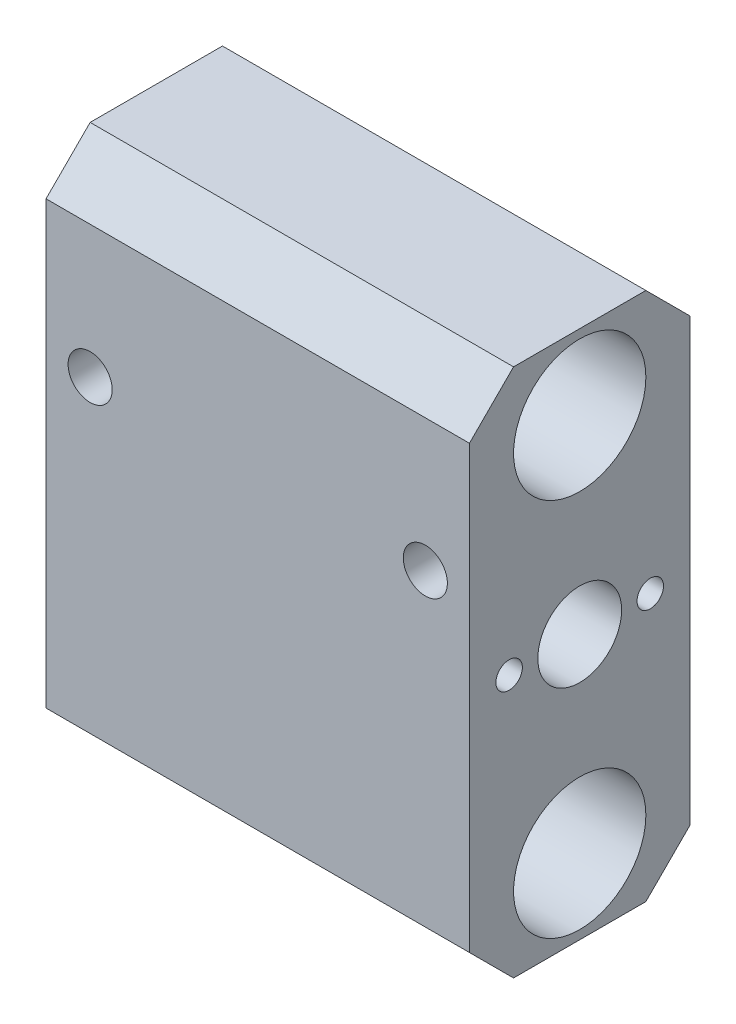
ISO-10303-21;
HEADER;
FILE_DESCRIPTION(('STEP AP214'),'2;1');
FILE_NAME('part.step','',(''),(''),'','','');
FILE_SCHEMA(('AUTOMOTIVE_DESIGN { 1 0 10303 214 1 1 1 1 }'));
ENDSEC;
DATA;
#1=APPLICATION_CONTEXT('core data for automotive mechanical design processes');
#2=APPLICATION_PROTOCOL_DEFINITION('international standard','automotive_design',2000,#1);
#3=PRODUCT_CONTEXT('',#1,'mechanical');
#4=PRODUCT('Part','Part','',(#3));
#5=PRODUCT_RELATED_PRODUCT_CATEGORY('part','',(#4));
#6=PRODUCT_DEFINITION_FORMATION('','',#4);
#7=PRODUCT_DEFINITION_CONTEXT('part definition',#1,'design');
#8=PRODUCT_DEFINITION('design','',#6,#7);
#9=PRODUCT_DEFINITION_SHAPE('','',#8);
#10=(LENGTH_UNIT() NAMED_UNIT(*) SI_UNIT(.MILLI.,.METRE.));
#11=(NAMED_UNIT(*) PLANE_ANGLE_UNIT() SI_UNIT($,.RADIAN.));
#12=(NAMED_UNIT(*) SI_UNIT($,.STERADIAN.) SOLID_ANGLE_UNIT());
#13=UNCERTAINTY_MEASURE_WITH_UNIT(LENGTH_MEASURE(1.E-05),#10,'distance_accuracy_value','');
#14=(GEOMETRIC_REPRESENTATION_CONTEXT(3) GLOBAL_UNCERTAINTY_ASSIGNED_CONTEXT((#13)) GLOBAL_UNIT_ASSIGNED_CONTEXT((#10,
#11,#12)) REPRESENTATION_CONTEXT('',''));
#15=CARTESIAN_POINT('',(0.,0.,0.));
#16=DIRECTION('',(0.,0.,1.));
#17=DIRECTION('',(1.,0.,0.));
#18=AXIS2_PLACEMENT_3D('',#15,#16,#17);
#19=CARTESIAN_POINT('',(48.,0.,0.));
#20=DIRECTION('',(-1.,0.,0.));
#21=DIRECTION('',(0.,0.,1.));
#22=AXIS2_PLACEMENT_3D('',#19,#20,#21);
#23=PLANE('',#22);
#24=CARTESIAN_POINT('',(48.,0.,-8.));
#25=DIRECTION('',(1.,0.,0.));
#26=DIRECTION('',(0.,0.,-1.));
#27=AXIS2_PLACEMENT_3D('',#24,#25,#26);
#28=CIRCLE('',#27,1.5);
#29=CARTESIAN_POINT('',(48.,0.,-9.5));
#30=VERTEX_POINT('',#29);
#31=EDGE_CURVE('E220',#30,#30,#28,.T.);
#32=ORIENTED_EDGE('',*,*,#31,.F.);
#33=EDGE_LOOP('',(#32));
#34=FACE_BOUND('',#33,.T.);
#35=CARTESIAN_POINT('',(48.,0.,8.));
#36=DIRECTION('',(1.,0.,0.));
#37=DIRECTION('',(0.,0.,-1.));
#38=AXIS2_PLACEMENT_3D('',#35,#36,#37);
#39=CIRCLE('',#38,1.5);
#40=CARTESIAN_POINT('',(48.,0.,6.5));
#41=VERTEX_POINT('',#40);
#42=EDGE_CURVE('E213',#41,#41,#39,.T.);
#43=ORIENTED_EDGE('',*,*,#42,.F.);
#44=EDGE_LOOP('',(#43));
#45=FACE_BOUND('',#44,.T.);
#46=DIRECTION('',(0.,0.,-1.));
#47=VECTOR('',#46,1.);
#48=CARTESIAN_POINT('',(48.,-30.,-12.5));
#49=LINE('',#48,#47);
#50=CARTESIAN_POINT('',(48.,-30.,7.50000000000001));
#51=VERTEX_POINT('',#50);
#52=CARTESIAN_POINT('',(48.,-30.,-7.50000000000001));
#53=VERTEX_POINT('',#52);
#54=EDGE_CURVE('E173',#51,#53,#49,.T.);
#55=ORIENTED_EDGE('',*,*,#54,.T.);
#56=DIRECTION('',(0.,-0.707106781186546,0.707106781186549));
#57=VECTOR('',#56,1.);
#58=CARTESIAN_POINT('',(48.,-25.,-12.5));
#59=LINE('',#58,#57);
#60=CARTESIAN_POINT('',(48.,-25.,-12.5));
#61=VERTEX_POINT('',#60);
#62=EDGE_CURVE('E151',#53,#61,#59,.F.);
#63=ORIENTED_EDGE('',*,*,#62,.T.);
#64=DIRECTION('',(0.,1.,0.));
#65=VECTOR('',#64,1.);
#66=CARTESIAN_POINT('',(48.,30.,-12.5));
#67=LINE('',#66,#65);
#68=CARTESIAN_POINT('',(48.,25.,-12.5));
#69=VERTEX_POINT('',#68);
#70=EDGE_CURVE('E121',#61,#69,#67,.T.);
#71=ORIENTED_EDGE('',*,*,#70,.T.);
#72=DIRECTION('',(0.,-0.707106781186549,-0.707106781186547));
#73=VECTOR('',#72,1.);
#74=CARTESIAN_POINT('',(48.,30.,-7.50000000000001));
#75=LINE('',#74,#73);
#76=CARTESIAN_POINT('',(48.,30.,-7.50000000000001));
#77=VERTEX_POINT('',#76);
#78=EDGE_CURVE('E57',#69,#77,#75,.F.);
#79=ORIENTED_EDGE('',*,*,#78,.T.);
#80=DIRECTION('',(0.,0.,1.));
#81=VECTOR('',#80,1.);
#82=CARTESIAN_POINT('',(48.,30.,-12.5));
#83=LINE('',#82,#81);
#84=CARTESIAN_POINT('',(48.,30.,7.49999999999999));
#85=VERTEX_POINT('',#84);
#86=EDGE_CURVE('E137',#77,#85,#83,.T.);
#87=ORIENTED_EDGE('',*,*,#86,.T.);
#88=DIRECTION('',(0.,0.707106781186546,-0.707106781186549));
#89=VECTOR('',#88,1.);
#90=CARTESIAN_POINT('',(48.,25.,12.5));
#91=LINE('',#90,#89);
#92=CARTESIAN_POINT('',(48.,25.,12.5));
#93=VERTEX_POINT('',#92);
#94=EDGE_CURVE('E147',#85,#93,#91,.F.);
#95=ORIENTED_EDGE('',*,*,#94,.T.);
#96=DIRECTION('',(0.,-1.,0.));
#97=VECTOR('',#96,1.);
#98=CARTESIAN_POINT('',(48.,30.,12.5));
#99=LINE('',#98,#97);
#100=CARTESIAN_POINT('',(48.,-25.,12.5));
#101=VERTEX_POINT('',#100);
#102=EDGE_CURVE('E131',#93,#101,#99,.T.);
#103=ORIENTED_EDGE('',*,*,#102,.T.);
#104=DIRECTION('',(0.,0.707106781186548,0.707106781186547));
#105=VECTOR('',#104,1.);
#106=CARTESIAN_POINT('',(48.,-30.,7.50000000000001));
#107=LINE('',#106,#105);
#108=EDGE_CURVE('E149',#101,#51,#107,.F.);
#109=ORIENTED_EDGE('',*,*,#108,.T.);
#110=EDGE_LOOP('',(#55,#63,#71,#79,#87,#95,#103,#109));
#111=FACE_BOUND('',#110,.T.);
#112=CARTESIAN_POINT('',(48.,0.,0.));
#113=DIRECTION('',(1.,0.,0.));
#114=DIRECTION('',(0.,0.,-1.));
#115=AXIS2_PLACEMENT_3D('',#112,#113,#114);
#116=CIRCLE('',#115,4.75);
#117=CARTESIAN_POINT('',(48.,0.,-4.75));
#118=VERTEX_POINT('',#117);
#119=EDGE_CURVE('E182',#118,#118,#116,.T.);
#120=ORIENTED_EDGE('',*,*,#119,.F.);
#121=EDGE_LOOP('',(#120));
#122=FACE_BOUND('',#121,.T.);
#123=CARTESIAN_POINT('',(48.,21.5,0.));
#124=DIRECTION('',(1.,0.,0.));
#125=DIRECTION('',(0.,0.,-1.));
#126=AXIS2_PLACEMENT_3D('',#123,#124,#125);
#127=CIRCLE('',#126,7.5);
#128=CARTESIAN_POINT('',(48.,21.5,-7.5));
#129=VERTEX_POINT('',#128);
#130=EDGE_CURVE('E187',#129,#129,#127,.T.);
#131=ORIENTED_EDGE('',*,*,#130,.F.);
#132=EDGE_LOOP('',(#131));
#133=FACE_BOUND('',#132,.T.);
#134=CARTESIAN_POINT('',(48.,-21.5,0.));
#135=DIRECTION('',(1.,0.,0.));
#136=DIRECTION('',(0.,0.,-1.));
#137=AXIS2_PLACEMENT_3D('',#134,#135,#136);
#138=CIRCLE('',#137,7.5);
#139=CARTESIAN_POINT('',(48.,-21.5,-7.5));
#140=VERTEX_POINT('',#139);
#141=EDGE_CURVE('E192',#140,#140,#138,.T.);
#142=ORIENTED_EDGE('',*,*,#141,.F.);
#143=EDGE_LOOP('',(#142));
#144=FACE_BOUND('',#143,.T.);
#145=ADVANCED_FACE('F37',(#34,#45,#111,#122,#133,#144),#23,.F.);
#146=CARTESIAN_POINT('',(0.,0.,0.));
#147=DIRECTION('',(-1.,0.,0.));
#148=DIRECTION('',(0.,0.,1.));
#149=AXIS2_PLACEMENT_3D('',#146,#147,#148);
#150=PLANE('',#149);
#151=CARTESIAN_POINT('',(0.,0.,8.));
#152=DIRECTION('',(-1.,0.,0.));
#153=DIRECTION('',(0.,0.,1.));
#154=AXIS2_PLACEMENT_3D('',#151,#152,#153);
#155=CIRCLE('',#154,1.5);
#156=CARTESIAN_POINT('',(0.,0.,9.5));
#157=VERTEX_POINT('',#156);
#158=EDGE_CURVE('E208',#157,#157,#155,.T.);
#159=ORIENTED_EDGE('',*,*,#158,.F.);
#160=EDGE_LOOP('',(#159));
#161=FACE_BOUND('',#160,.T.);
#162=CARTESIAN_POINT('',(0.,0.,-8.));
#163=DIRECTION('',(-1.,0.,0.));
#164=DIRECTION('',(0.,0.,1.));
#165=AXIS2_PLACEMENT_3D('',#162,#163,#164);
#166=CIRCLE('',#165,1.5);
#167=CARTESIAN_POINT('',(0.,0.,-6.5));
#168=VERTEX_POINT('',#167);
#169=EDGE_CURVE('E201',#168,#168,#166,.T.);
#170=ORIENTED_EDGE('',*,*,#169,.F.);
#171=EDGE_LOOP('',(#170));
#172=FACE_BOUND('',#171,.T.);
#173=CARTESIAN_POINT('',(0.,21.5,0.));
#174=DIRECTION('',(1.,0.,0.));
#175=DIRECTION('',(0.,0.,-1.));
#176=AXIS2_PLACEMENT_3D('',#173,#174,#175);
#177=CIRCLE('',#176,7.5);
#178=CARTESIAN_POINT('',(0.,21.5,-7.5));
#179=VERTEX_POINT('',#178);
#180=EDGE_CURVE('E189',#179,#179,#177,.T.);
#181=ORIENTED_EDGE('',*,*,#180,.T.);
#182=EDGE_LOOP('',(#181));
#183=FACE_BOUND('',#182,.T.);
#184=DIRECTION('',(0.,1.,0.));
#185=VECTOR('',#184,1.);
#186=CARTESIAN_POINT('',(0.,30.,-12.5));
#187=LINE('',#186,#185);
#188=CARTESIAN_POINT('',(0.,-25.,-12.5));
#189=VERTEX_POINT('',#188);
#190=CARTESIAN_POINT('',(0.,25.,-12.5));
#191=VERTEX_POINT('',#190);
#192=EDGE_CURVE('E119',#189,#191,#187,.T.);
#193=ORIENTED_EDGE('',*,*,#192,.F.);
#194=DIRECTION('',(0.,0.707106781186546,-0.707106781186549));
#195=VECTOR('',#194,1.);
#196=CARTESIAN_POINT('',(0.,-18.75,-18.75));
#197=LINE('',#196,#195);
#198=CARTESIAN_POINT('',(0.,-30.,-7.50000000000001));
#199=VERTEX_POINT('',#198);
#200=EDGE_CURVE('E102',#189,#199,#197,.F.);
#201=ORIENTED_EDGE('',*,*,#200,.T.);
#202=DIRECTION('',(0.,0.,-1.));
#203=VECTOR('',#202,1.);
#204=CARTESIAN_POINT('',(0.,-30.,-12.5));
#205=LINE('',#204,#203);
#206=CARTESIAN_POINT('',(0.,-30.,7.50000000000001));
#207=VERTEX_POINT('',#206);
#208=EDGE_CURVE('E129',#207,#199,#205,.T.);
#209=ORIENTED_EDGE('',*,*,#208,.F.);
#210=DIRECTION('',(0.,-0.707106781186548,-0.707106781186547));
#211=VECTOR('',#210,1.);
#212=CARTESIAN_POINT('',(0.,-18.75,18.75));
#213=LINE('',#212,#211);
#214=CARTESIAN_POINT('',(0.,-25.,12.5));
#215=VERTEX_POINT('',#214);
#216=EDGE_CURVE('E113',#207,#215,#213,.F.);
#217=ORIENTED_EDGE('',*,*,#216,.T.);
#218=DIRECTION('',(0.,-1.,0.));
#219=VECTOR('',#218,1.);
#220=CARTESIAN_POINT('',(0.,30.,12.5));
#221=LINE('',#220,#219);
#222=CARTESIAN_POINT('',(0.,25.,12.5));
#223=VERTEX_POINT('',#222);
#224=EDGE_CURVE('E133',#223,#215,#221,.T.);
#225=ORIENTED_EDGE('',*,*,#224,.F.);
#226=DIRECTION('',(0.,-0.707106781186546,0.707106781186549));
#227=VECTOR('',#226,1.);
#228=CARTESIAN_POINT('',(0.,18.7500000000001,18.75));
#229=LINE('',#228,#227);
#230=CARTESIAN_POINT('',(0.,30.,7.49999999999999));
#231=VERTEX_POINT('',#230);
#232=EDGE_CURVE('E140',#223,#231,#229,.F.);
#233=ORIENTED_EDGE('',*,*,#232,.T.);
#234=DIRECTION('',(0.,0.,1.));
#235=VECTOR('',#234,1.);
#236=CARTESIAN_POINT('',(0.,30.,-12.5));
#237=LINE('',#236,#235);
#238=CARTESIAN_POINT('',(0.,30.,-7.50000000000001));
#239=VERTEX_POINT('',#238);
#240=EDGE_CURVE('E128',#239,#231,#237,.T.);
#241=ORIENTED_EDGE('',*,*,#240,.F.);
#242=DIRECTION('',(0.,0.707106781186549,0.707106781186547));
#243=VECTOR('',#242,1.);
#244=CARTESIAN_POINT('',(0.,18.75,-18.75));
#245=LINE('',#244,#243);
#246=EDGE_CURVE('E122',#239,#191,#245,.F.);
#247=ORIENTED_EDGE('',*,*,#246,.T.);
#248=EDGE_LOOP('',(#193,#201,#209,#217,#225,#233,#241,#247));
#249=FACE_BOUND('',#248,.T.);
#250=CARTESIAN_POINT('',(0.,0.,0.));
#251=DIRECTION('',(1.,0.,0.));
#252=DIRECTION('',(0.,0.,-1.));
#253=AXIS2_PLACEMENT_3D('',#250,#251,#252);
#254=CIRCLE('',#253,4.75);
#255=CARTESIAN_POINT('',(0.,0.,-4.75));
#256=VERTEX_POINT('',#255);
#257=EDGE_CURVE('E178',#256,#256,#254,.T.);
#258=ORIENTED_EDGE('',*,*,#257,.T.);
#259=EDGE_LOOP('',(#258));
#260=FACE_BOUND('',#259,.T.);
#261=CARTESIAN_POINT('',(0.,-21.5,0.));
#262=DIRECTION('',(1.,0.,0.));
#263=DIRECTION('',(0.,0.,-1.));
#264=AXIS2_PLACEMENT_3D('',#261,#262,#263);
#265=CIRCLE('',#264,7.5);
#266=CARTESIAN_POINT('',(0.,-21.5,-7.5));
#267=VERTEX_POINT('',#266);
#268=EDGE_CURVE('E195',#267,#267,#265,.T.);
#269=ORIENTED_EDGE('',*,*,#268,.T.);
#270=EDGE_LOOP('',(#269));
#271=FACE_BOUND('',#270,.T.);
#272=ADVANCED_FACE('F125',(#161,#172,#183,#249,#260,#271),#150,.T.);
#273=CARTESIAN_POINT('',(48.,30.,12.5));
#274=DIRECTION('',(0.,0.,-1.));
#275=DIRECTION('',(0.,1.,0.));
#276=AXIS2_PLACEMENT_3D('',#273,#274,#275);
#277=PLANE('',#276);
#278=CARTESIAN_POINT('',(5.,9.99999999999999,12.5));
#279=DIRECTION('',(0.,0.,1.));
#280=DIRECTION('',(1.,0.,0.));
#281=AXIS2_PLACEMENT_3D('',#278,#279,#280);
#282=CIRCLE('',#281,2.5);
#283=CARTESIAN_POINT('',(7.5,9.99999999999999,12.5));
#284=VERTEX_POINT('',#283);
#285=EDGE_CURVE('E232',#284,#284,#282,.T.);
#286=ORIENTED_EDGE('',*,*,#285,.F.);
#287=EDGE_LOOP('',(#286));
#288=FACE_BOUND('',#287,.T.);
#289=CARTESIAN_POINT('',(43.,9.99999999999999,12.5));
#290=DIRECTION('',(0.,0.,1.));
#291=DIRECTION('',(-1.,0.,0.));
#292=AXIS2_PLACEMENT_3D('',#289,#290,#291);
#293=CIRCLE('',#292,2.49999999999999);
#294=CARTESIAN_POINT('',(40.5,9.99999999999999,12.5));
#295=VERTEX_POINT('',#294);
#296=EDGE_CURVE('E225',#295,#295,#293,.T.);
#297=ORIENTED_EDGE('',*,*,#296,.F.);
#298=EDGE_LOOP('',(#297));
#299=FACE_BOUND('',#298,.T.);
#300=ORIENTED_EDGE('',*,*,#224,.T.);
#301=DIRECTION('',(1.,0.,0.));
#302=VECTOR('',#301,1.);
#303=CARTESIAN_POINT('',(48.,-25.,12.5));
#304=LINE('',#303,#302);
#305=EDGE_CURVE('E156',#215,#101,#304,.T.);
#306=ORIENTED_EDGE('',*,*,#305,.T.);
#307=ORIENTED_EDGE('',*,*,#102,.F.);
#308=DIRECTION('',(-1.,0.,0.));
#309=VECTOR('',#308,1.);
#310=CARTESIAN_POINT('',(48.,25.,12.5));
#311=LINE('',#310,#309);
#312=EDGE_CURVE('E153',#93,#223,#311,.T.);
#313=ORIENTED_EDGE('',*,*,#312,.T.);
#314=EDGE_LOOP('',(#300,#306,#307,#313));
#315=FACE_BOUND('',#314,.T.);
#316=ADVANCED_FACE('F169',(#288,#299,#315),#277,.F.);
#317=CARTESIAN_POINT('',(48.,-30.,-12.5));
#318=DIRECTION('',(0.,1.,0.));
#319=DIRECTION('',(0.,0.,1.));
#320=AXIS2_PLACEMENT_3D('',#317,#318,#319);
#321=PLANE('',#320);
#322=ORIENTED_EDGE('',*,*,#208,.T.);
#323=DIRECTION('',(1.,0.,0.));
#324=VECTOR('',#323,1.);
#325=CARTESIAN_POINT('',(48.,-30.,-7.50000000000001));
#326=LINE('',#325,#324);
#327=EDGE_CURVE('E107',#199,#53,#326,.T.);
#328=ORIENTED_EDGE('',*,*,#327,.T.);
#329=ORIENTED_EDGE('',*,*,#54,.F.);
#330=DIRECTION('',(-1.,0.,0.));
#331=VECTOR('',#330,1.);
#332=CARTESIAN_POINT('',(48.,-30.,7.50000000000001));
#333=LINE('',#332,#331);
#334=EDGE_CURVE('E112',#51,#207,#333,.T.);
#335=ORIENTED_EDGE('',*,*,#334,.T.);
#336=EDGE_LOOP('',(#322,#328,#329,#335));
#337=FACE_BOUND('',#336,.T.);
#338=ADVANCED_FACE('F260',(#337),#321,.F.);
#339=CARTESIAN_POINT('',(48.,30.,-12.5));
#340=DIRECTION('',(0.,0.,1.));
#341=DIRECTION('',(0.,-1.,0.));
#342=AXIS2_PLACEMENT_3D('',#339,#340,#341);
#343=PLANE('',#342);
#344=CARTESIAN_POINT('',(10.,9.5,-12.5));
#345=DIRECTION('',(0.,0.,-1.));
#346=DIRECTION('',(0.,1.,0.));
#347=AXIS2_PLACEMENT_3D('',#344,#345,#346);
#348=CIRCLE('',#347,1.5);
#349=CARTESIAN_POINT('',(10.,11.,-12.5));
#350=VERTEX_POINT('',#349);
#351=EDGE_CURVE('E243',#350,#350,#348,.T.);
#352=ORIENTED_EDGE('',*,*,#351,.F.);
#353=EDGE_LOOP('',(#352));
#354=FACE_BOUND('',#353,.T.);
#355=CARTESIAN_POINT('',(10.,-9.5,-12.5));
#356=DIRECTION('',(0.,0.,-1.));
#357=DIRECTION('',(0.,-1.,0.));
#358=AXIS2_PLACEMENT_3D('',#355,#356,#357);
#359=CIRCLE('',#358,1.5);
#360=CARTESIAN_POINT('',(10.,-11.,-12.5));
#361=VERTEX_POINT('',#360);
#362=EDGE_CURVE('E237',#361,#361,#359,.T.);
#363=ORIENTED_EDGE('',*,*,#362,.F.);
#364=EDGE_LOOP('',(#363));
#365=FACE_BOUND('',#364,.T.);
#366=ORIENTED_EDGE('',*,*,#70,.F.);
#367=DIRECTION('',(-1.,0.,0.));
#368=VECTOR('',#367,1.);
#369=CARTESIAN_POINT('',(48.,-25.,-12.5));
#370=LINE('',#369,#368);
#371=EDGE_CURVE('E106',#61,#189,#370,.T.);
#372=ORIENTED_EDGE('',*,*,#371,.T.);
#373=ORIENTED_EDGE('',*,*,#192,.T.);
#374=DIRECTION('',(1.,0.,0.));
#375=VECTOR('',#374,1.);
#376=CARTESIAN_POINT('',(48.,25.,-12.5));
#377=LINE('',#376,#375);
#378=EDGE_CURVE('E123',#191,#69,#377,.T.);
#379=ORIENTED_EDGE('',*,*,#378,.T.);
#380=EDGE_LOOP('',(#366,#372,#373,#379));
#381=FACE_BOUND('',#380,.T.);
#382=ADVANCED_FACE('F118',(#354,#365,#381),#343,.F.);
#383=CARTESIAN_POINT('',(48.,30.,-12.5));
#384=DIRECTION('',(0.,-1.,0.));
#385=DIRECTION('',(0.,0.,-1.));
#386=AXIS2_PLACEMENT_3D('',#383,#384,#385);
#387=PLANE('',#386);
#388=ORIENTED_EDGE('',*,*,#240,.T.);
#389=DIRECTION('',(1.,0.,0.));
#390=VECTOR('',#389,1.);
#391=CARTESIAN_POINT('',(48.,30.,7.49999999999999));
#392=LINE('',#391,#390);
#393=EDGE_CURVE('E11',#231,#85,#392,.T.);
#394=ORIENTED_EDGE('',*,*,#393,.T.);
#395=ORIENTED_EDGE('',*,*,#86,.F.);
#396=DIRECTION('',(-1.,0.,0.));
#397=VECTOR('',#396,1.);
#398=CARTESIAN_POINT('',(48.,30.,-7.50000000000001));
#399=LINE('',#398,#397);
#400=EDGE_CURVE('E45',#77,#239,#399,.T.);
#401=ORIENTED_EDGE('',*,*,#400,.T.);
#402=EDGE_LOOP('',(#388,#394,#395,#401));
#403=FACE_BOUND('',#402,.T.);
#404=ADVANCED_FACE('F159',(#403),#387,.F.);
#405=CARTESIAN_POINT('',(48.,0.,0.));
#406=DIRECTION('',(-1.,0.,0.));
#407=DIRECTION('',(0.,0.,1.));
#408=AXIS2_PLACEMENT_3D('',#405,#406,#407);
#409=CYLINDRICAL_SURFACE('',#408,4.75);
#410=ORIENTED_EDGE('',*,*,#119,.T.);
#411=EDGE_LOOP('',(#410));
#412=FACE_BOUND('',#411,.T.);
#413=ORIENTED_EDGE('',*,*,#257,.F.);
#414=EDGE_LOOP('',(#413));
#415=FACE_BOUND('',#414,.T.);
#416=ADVANCED_FACE('F290',(#412,#415),#409,.F.);
#417=CARTESIAN_POINT('',(48.,21.5,0.));
#418=DIRECTION('',(-1.,0.,0.));
#419=DIRECTION('',(0.,0.,1.));
#420=AXIS2_PLACEMENT_3D('',#417,#418,#419);
#421=CYLINDRICAL_SURFACE('',#420,7.5);
#422=ORIENTED_EDGE('',*,*,#130,.T.);
#423=EDGE_LOOP('',(#422));
#424=FACE_BOUND('',#423,.T.);
#425=ORIENTED_EDGE('',*,*,#180,.F.);
#426=EDGE_LOOP('',(#425));
#427=FACE_BOUND('',#426,.T.);
#428=ADVANCED_FACE('F330',(#424,#427),#421,.F.);
#429=CARTESIAN_POINT('',(48.,-21.5,0.));
#430=DIRECTION('',(-1.,0.,0.));
#431=DIRECTION('',(0.,0.,1.));
#432=AXIS2_PLACEMENT_3D('',#429,#430,#431);
#433=CYLINDRICAL_SURFACE('',#432,7.5);
#434=ORIENTED_EDGE('',*,*,#141,.T.);
#435=EDGE_LOOP('',(#434));
#436=FACE_BOUND('',#435,.T.);
#437=ORIENTED_EDGE('',*,*,#268,.F.);
#438=EDGE_LOOP('',(#437));
#439=FACE_BOUND('',#438,.T.);
#440=ADVANCED_FACE('F326',(#436,#439),#433,.F.);
#441=CARTESIAN_POINT('',(10.,0.,-8.));
#442=DIRECTION('',(-1.,0.,0.));
#443=DIRECTION('',(0.,0.,1.));
#444=AXIS2_PLACEMENT_3D('',#441,#442,#443);
#445=CYLINDRICAL_SURFACE('',#444,1.5);
#446=CARTESIAN_POINT('',(10.,0.,-8.));
#447=DIRECTION('',(-1.,0.,0.));
#448=DIRECTION('',(0.,0.,1.));
#449=AXIS2_PLACEMENT_3D('',#446,#447,#448);
#450=CIRCLE('',#449,1.5);
#451=CARTESIAN_POINT('',(10.,0.,-6.5));
#452=VERTEX_POINT('',#451);
#453=EDGE_CURVE('E204',#452,#452,#450,.T.);
#454=ORIENTED_EDGE('',*,*,#453,.F.);
#455=EDGE_LOOP('',(#454));
#456=FACE_BOUND('',#455,.T.);
#457=ORIENTED_EDGE('',*,*,#169,.T.);
#458=EDGE_LOOP('',(#457));
#459=FACE_BOUND('',#458,.T.);
#460=ADVANCED_FACE('F329',(#456,#459),#445,.F.);
#461=CARTESIAN_POINT('',(10.,0.,-8.));
#462=DIRECTION('',(-1.,0.,0.));
#463=DIRECTION('',(0.,0.,1.));
#464=AXIS2_PLACEMENT_3D('',#461,#462,#463);
#465=PLANE('',#464);
#466=ORIENTED_EDGE('',*,*,#453,.T.);
#467=EDGE_LOOP('',(#466));
#468=FACE_BOUND('',#467,.T.);
#469=ADVANCED_FACE('F338',(#468),#465,.T.);
#470=CARTESIAN_POINT('',(10.,0.,8.));
#471=DIRECTION('',(-1.,0.,0.));
#472=DIRECTION('',(0.,0.,1.));
#473=AXIS2_PLACEMENT_3D('',#470,#471,#472);
#474=CYLINDRICAL_SURFACE('',#473,1.5);
#475=CARTESIAN_POINT('',(10.,0.,8.));
#476=DIRECTION('',(-1.,0.,0.));
#477=DIRECTION('',(0.,0.,1.));
#478=AXIS2_PLACEMENT_3D('',#475,#476,#477);
#479=CIRCLE('',#478,1.5);
#480=CARTESIAN_POINT('',(10.,0.,9.5));
#481=VERTEX_POINT('',#480);
#482=EDGE_CURVE('E198',#481,#481,#479,.T.);
#483=ORIENTED_EDGE('',*,*,#482,.F.);
#484=EDGE_LOOP('',(#483));
#485=FACE_BOUND('',#484,.T.);
#486=ORIENTED_EDGE('',*,*,#158,.T.);
#487=EDGE_LOOP('',(#486));
#488=FACE_BOUND('',#487,.T.);
#489=ADVANCED_FACE('F345',(#485,#488),#474,.F.);
#490=CARTESIAN_POINT('',(10.,0.,8.));
#491=DIRECTION('',(-1.,0.,0.));
#492=DIRECTION('',(0.,0.,1.));
#493=AXIS2_PLACEMENT_3D('',#490,#491,#492);
#494=PLANE('',#493);
#495=ORIENTED_EDGE('',*,*,#482,.T.);
#496=EDGE_LOOP('',(#495));
#497=FACE_BOUND('',#496,.T.);
#498=ADVANCED_FACE('F349',(#497),#494,.T.);
#499=CARTESIAN_POINT('',(38.,0.,8.));
#500=DIRECTION('',(1.,0.,0.));
#501=DIRECTION('',(0.,0.,-1.));
#502=AXIS2_PLACEMENT_3D('',#499,#500,#501);
#503=CYLINDRICAL_SURFACE('',#502,1.5);
#504=CARTESIAN_POINT('',(38.,0.,8.));
#505=DIRECTION('',(1.,0.,0.));
#506=DIRECTION('',(0.,0.,-1.));
#507=AXIS2_PLACEMENT_3D('',#504,#505,#506);
#508=CIRCLE('',#507,1.5);
#509=CARTESIAN_POINT('',(38.,0.,6.5));
#510=VERTEX_POINT('',#509);
#511=EDGE_CURVE('E216',#510,#510,#508,.T.);
#512=ORIENTED_EDGE('',*,*,#511,.F.);
#513=EDGE_LOOP('',(#512));
#514=FACE_BOUND('',#513,.T.);
#515=ORIENTED_EDGE('',*,*,#42,.T.);
#516=EDGE_LOOP('',(#515));
#517=FACE_BOUND('',#516,.T.);
#518=ADVANCED_FACE('F353',(#514,#517),#503,.F.);
#519=CARTESIAN_POINT('',(38.,0.,8.));
#520=DIRECTION('',(1.,0.,0.));
#521=DIRECTION('',(0.,0.,-1.));
#522=AXIS2_PLACEMENT_3D('',#519,#520,#521);
#523=PLANE('',#522);
#524=ORIENTED_EDGE('',*,*,#511,.T.);
#525=EDGE_LOOP('',(#524));
#526=FACE_BOUND('',#525,.T.);
#527=ADVANCED_FACE('F357',(#526),#523,.T.);
#528=CARTESIAN_POINT('',(38.,0.,-8.));
#529=DIRECTION('',(1.,0.,0.));
#530=DIRECTION('',(0.,0.,-1.));
#531=AXIS2_PLACEMENT_3D('',#528,#529,#530);
#532=CYLINDRICAL_SURFACE('',#531,1.5);
#533=CARTESIAN_POINT('',(38.,0.,-8.));
#534=DIRECTION('',(1.,0.,0.));
#535=DIRECTION('',(0.,0.,-1.));
#536=AXIS2_PLACEMENT_3D('',#533,#534,#535);
#537=CIRCLE('',#536,1.5);
#538=CARTESIAN_POINT('',(38.,0.,-9.5));
#539=VERTEX_POINT('',#538);
#540=EDGE_CURVE('E205',#539,#539,#537,.T.);
#541=ORIENTED_EDGE('',*,*,#540,.F.);
#542=EDGE_LOOP('',(#541));
#543=FACE_BOUND('',#542,.T.);
#544=ORIENTED_EDGE('',*,*,#31,.T.);
#545=EDGE_LOOP('',(#544));
#546=FACE_BOUND('',#545,.T.);
#547=ADVANCED_FACE('F361',(#543,#546),#532,.F.);
#548=CARTESIAN_POINT('',(38.,0.,-8.));
#549=DIRECTION('',(1.,0.,0.));
#550=DIRECTION('',(0.,0.,-1.));
#551=AXIS2_PLACEMENT_3D('',#548,#549,#550);
#552=PLANE('',#551);
#553=ORIENTED_EDGE('',*,*,#540,.T.);
#554=EDGE_LOOP('',(#553));
#555=FACE_BOUND('',#554,.T.);
#556=ADVANCED_FACE('F304',(#555),#552,.T.);
#557=CARTESIAN_POINT('',(48.,-25.,-12.5));
#558=DIRECTION('',(0.,0.707106781186549,0.707106781186546));
#559=DIRECTION('',(-1.,0.,0.));
#560=AXIS2_PLACEMENT_3D('',#557,#558,#559);
#561=PLANE('',#560);
#562=ORIENTED_EDGE('',*,*,#62,.F.);
#563=ORIENTED_EDGE('',*,*,#327,.F.);
#564=ORIENTED_EDGE('',*,*,#200,.F.);
#565=ORIENTED_EDGE('',*,*,#371,.F.);
#566=EDGE_LOOP('',(#562,#563,#564,#565));
#567=FACE_BOUND('',#566,.T.);
#568=ADVANCED_FACE('F105',(#567),#561,.F.);
#569=CARTESIAN_POINT('',(48.,-30.,7.50000000000001));
#570=DIRECTION('',(0.,0.707106781186547,-0.707106781186548));
#571=DIRECTION('',(-1.,0.,0.));
#572=AXIS2_PLACEMENT_3D('',#569,#570,#571);
#573=PLANE('',#572);
#574=ORIENTED_EDGE('',*,*,#108,.F.);
#575=ORIENTED_EDGE('',*,*,#305,.F.);
#576=ORIENTED_EDGE('',*,*,#216,.F.);
#577=ORIENTED_EDGE('',*,*,#334,.F.);
#578=EDGE_LOOP('',(#574,#575,#576,#577));
#579=FACE_BOUND('',#578,.T.);
#580=ADVANCED_FACE('F303',(#579),#573,.F.);
#581=CARTESIAN_POINT('',(48.,25.,12.5));
#582=DIRECTION('',(0.,-0.707106781186549,-0.707106781186546));
#583=DIRECTION('',(-1.,0.,0.));
#584=AXIS2_PLACEMENT_3D('',#581,#582,#583);
#585=PLANE('',#584);
#586=ORIENTED_EDGE('',*,*,#94,.F.);
#587=ORIENTED_EDGE('',*,*,#393,.F.);
#588=ORIENTED_EDGE('',*,*,#232,.F.);
#589=ORIENTED_EDGE('',*,*,#312,.F.);
#590=EDGE_LOOP('',(#586,#587,#588,#589));
#591=FACE_BOUND('',#590,.T.);
#592=ADVANCED_FACE('F166',(#591),#585,.F.);
#593=CARTESIAN_POINT('',(48.,30.,-7.50000000000001));
#594=DIRECTION('',(0.,-0.707106781186547,0.707106781186549));
#595=DIRECTION('',(-1.,0.,0.));
#596=AXIS2_PLACEMENT_3D('',#593,#594,#595);
#597=PLANE('',#596);
#598=ORIENTED_EDGE('',*,*,#78,.F.);
#599=ORIENTED_EDGE('',*,*,#378,.F.);
#600=ORIENTED_EDGE('',*,*,#246,.F.);
#601=ORIENTED_EDGE('',*,*,#400,.F.);
#602=EDGE_LOOP('',(#598,#599,#600,#601));
#603=FACE_BOUND('',#602,.T.);
#604=ADVANCED_FACE('F39',(#603),#597,.F.);
#605=CARTESIAN_POINT('',(43.,9.99999999999999,7.5));
#606=DIRECTION('',(0.,0.,1.));
#607=DIRECTION('',(1.,0.,0.));
#608=AXIS2_PLACEMENT_3D('',#605,#606,#607);
#609=CYLINDRICAL_SURFACE('',#608,2.49999999999999);
#610=CARTESIAN_POINT('',(43.,9.99999999999999,7.5));
#611=DIRECTION('',(0.,0.,1.));
#612=DIRECTION('',(-1.,0.,0.));
#613=AXIS2_PLACEMENT_3D('',#610,#611,#612);
#614=CIRCLE('',#613,2.49999999999999);
#615=CARTESIAN_POINT('',(40.5,9.99999999999999,7.5));
#616=VERTEX_POINT('',#615);
#617=EDGE_CURVE('E228',#616,#616,#614,.T.);
#618=ORIENTED_EDGE('',*,*,#617,.F.);
#619=EDGE_LOOP('',(#618));
#620=FACE_BOUND('',#619,.T.);
#621=ORIENTED_EDGE('',*,*,#296,.T.);
#622=EDGE_LOOP('',(#621));
#623=FACE_BOUND('',#622,.T.);
#624=ADVANCED_FACE('F311',(#620,#623),#609,.F.);
#625=CARTESIAN_POINT('',(43.,9.99999999999999,7.5));
#626=DIRECTION('',(0.,0.,-1.));
#627=DIRECTION('',(-1.,0.,0.));
#628=AXIS2_PLACEMENT_3D('',#625,#626,#627);
#629=PLANE('',#628);
#630=ORIENTED_EDGE('',*,*,#617,.T.);
#631=EDGE_LOOP('',(#630));
#632=FACE_BOUND('',#631,.T.);
#633=ADVANCED_FACE('F315',(#632),#629,.F.);
#634=CARTESIAN_POINT('',(5.,9.99999999999999,7.5));
#635=DIRECTION('',(0.,0.,1.));
#636=DIRECTION('',(1.,0.,0.));
#637=AXIS2_PLACEMENT_3D('',#634,#635,#636);
#638=CYLINDRICAL_SURFACE('',#637,2.5);
#639=CARTESIAN_POINT('',(5.,9.99999999999999,7.5));
#640=DIRECTION('',(0.,0.,1.));
#641=DIRECTION('',(1.,0.,0.));
#642=AXIS2_PLACEMENT_3D('',#639,#640,#641);
#643=CIRCLE('',#642,2.5);
#644=CARTESIAN_POINT('',(7.5,9.99999999999999,7.5));
#645=VERTEX_POINT('',#644);
#646=EDGE_CURVE('E217',#645,#645,#643,.T.);
#647=ORIENTED_EDGE('',*,*,#646,.F.);
#648=EDGE_LOOP('',(#647));
#649=FACE_BOUND('',#648,.T.);
#650=ORIENTED_EDGE('',*,*,#285,.T.);
#651=EDGE_LOOP('',(#650));
#652=FACE_BOUND('',#651,.T.);
#653=ADVANCED_FACE('F275',(#649,#652),#638,.F.);
#654=CARTESIAN_POINT('',(5.,9.99999999999999,7.5));
#655=DIRECTION('',(0.,0.,1.));
#656=DIRECTION('',(1.,0.,0.));
#657=AXIS2_PLACEMENT_3D('',#654,#655,#656);
#658=PLANE('',#657);
#659=ORIENTED_EDGE('',*,*,#646,.T.);
#660=EDGE_LOOP('',(#659));
#661=FACE_BOUND('',#660,.T.);
#662=ADVANCED_FACE('F266',(#661),#658,.T.);
#663=CARTESIAN_POINT('',(10.,-9.5,-7.5));
#664=DIRECTION('',(0.,0.,-1.));
#665=DIRECTION('',(0.,1.,0.));
#666=AXIS2_PLACEMENT_3D('',#663,#664,#665);
#667=CYLINDRICAL_SURFACE('',#666,1.5);
#668=CARTESIAN_POINT('',(10.,-9.5,-7.5));
#669=DIRECTION('',(0.,0.,-1.));
#670=DIRECTION('',(0.,-1.,0.));
#671=AXIS2_PLACEMENT_3D('',#668,#669,#670);
#672=CIRCLE('',#671,1.5);
#673=CARTESIAN_POINT('',(10.,-11.,-7.5));
#674=VERTEX_POINT('',#673);
#675=EDGE_CURVE('E240',#674,#674,#672,.T.);
#676=ORIENTED_EDGE('',*,*,#675,.F.);
#677=EDGE_LOOP('',(#676));
#678=FACE_BOUND('',#677,.T.);
#679=ORIENTED_EDGE('',*,*,#362,.T.);
#680=EDGE_LOOP('',(#679));
#681=FACE_BOUND('',#680,.T.);
#682=ADVANCED_FACE('F264',(#678,#681),#667,.F.);
#683=CARTESIAN_POINT('',(10.,-9.5,-7.5));
#684=DIRECTION('',(0.,0.,1.));
#685=DIRECTION('',(0.,-1.,0.));
#686=AXIS2_PLACEMENT_3D('',#683,#684,#685);
#687=PLANE('',#686);
#688=ORIENTED_EDGE('',*,*,#675,.T.);
#689=EDGE_LOOP('',(#688));
#690=FACE_BOUND('',#689,.T.);
#691=ADVANCED_FACE('F254',(#690),#687,.F.);
#692=CARTESIAN_POINT('',(10.,9.5,-7.5));
#693=DIRECTION('',(0.,0.,-1.));
#694=DIRECTION('',(0.,1.,0.));
#695=AXIS2_PLACEMENT_3D('',#692,#693,#694);
#696=CYLINDRICAL_SURFACE('',#695,1.5);
#697=CARTESIAN_POINT('',(10.,9.5,-7.5));
#698=DIRECTION('',(0.,0.,-1.));
#699=DIRECTION('',(0.,1.,0.));
#700=AXIS2_PLACEMENT_3D('',#697,#698,#699);
#701=CIRCLE('',#700,1.5);
#702=CARTESIAN_POINT('',(10.,11.,-7.5));
#703=VERTEX_POINT('',#702);
#704=EDGE_CURVE('E229',#703,#703,#701,.T.);
#705=ORIENTED_EDGE('',*,*,#704,.F.);
#706=EDGE_LOOP('',(#705));
#707=FACE_BOUND('',#706,.T.);
#708=ORIENTED_EDGE('',*,*,#351,.T.);
#709=EDGE_LOOP('',(#708));
#710=FACE_BOUND('',#709,.T.);
#711=ADVANCED_FACE('F251',(#707,#710),#696,.F.);
#712=CARTESIAN_POINT('',(10.,9.5,-7.5));
#713=DIRECTION('',(0.,0.,-1.));
#714=DIRECTION('',(0.,1.,0.));
#715=AXIS2_PLACEMENT_3D('',#712,#713,#714);
#716=PLANE('',#715);
#717=ORIENTED_EDGE('',*,*,#704,.T.);
#718=EDGE_LOOP('',(#717));
#719=FACE_BOUND('',#718,.T.);
#720=ADVANCED_FACE('F249',(#719),#716,.T.);
#721=CLOSED_SHELL('',(#145,#272,#316,#338,#382,#404,#416,#428,#440,#460,#469,#489,#498,#518,
#527,#547,#556,#568,#580,#592,#604,#624,#633,#653,#662,#682,#691,#711,#720));
#722=MANIFOLD_SOLID_BREP('B2',#721);
#723=ADVANCED_BREP_SHAPE_REPRESENTATION('',(#18,#722),#14);
#724=SHAPE_DEFINITION_REPRESENTATION(#9,#723);
ENDSEC;
END-ISO-10303-21;
